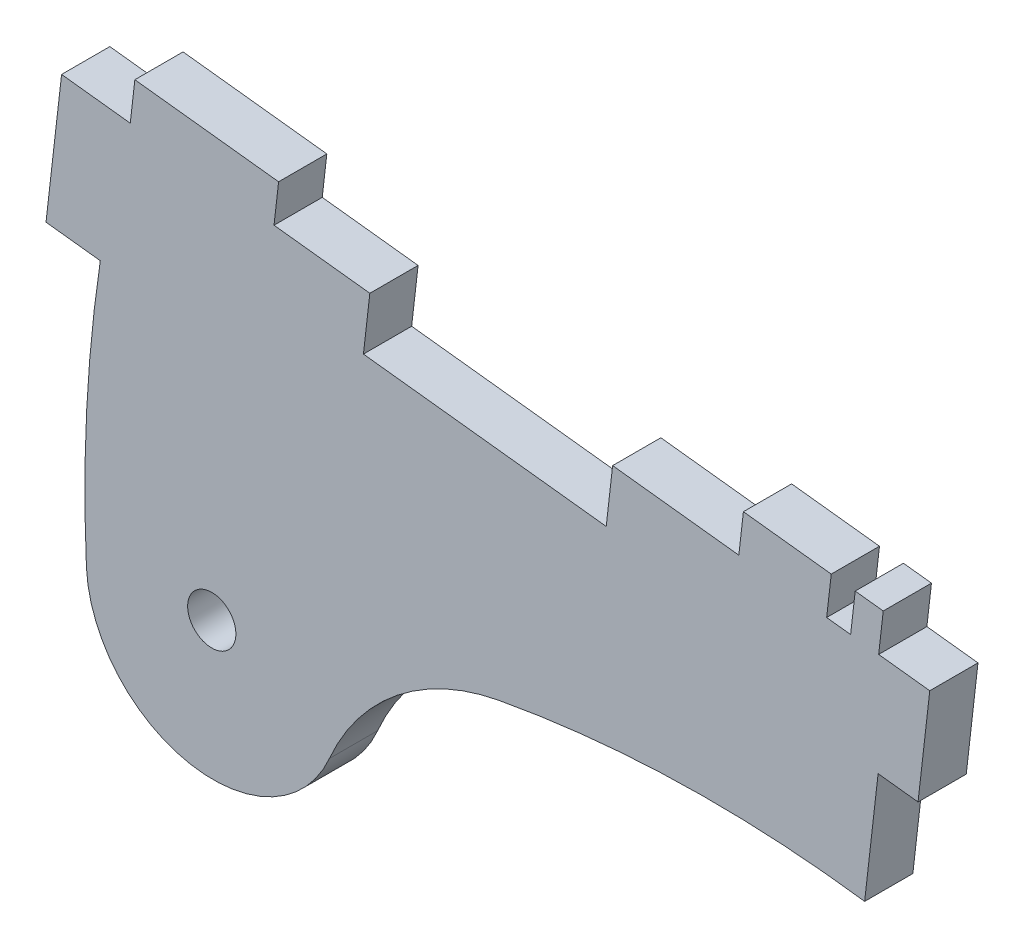
ISO-10303-21;
HEADER;
FILE_DESCRIPTION(('STEP AP214'),'2;1');
FILE_NAME('part.step','',(''),(''),'','','');
FILE_SCHEMA(('AUTOMOTIVE_DESIGN { 1 0 10303 214 1 1 1 1 }'));
ENDSEC;
DATA;
#1=APPLICATION_CONTEXT('core data for automotive mechanical design processes');
#2=APPLICATION_PROTOCOL_DEFINITION('international standard','automotive_design',2000,#1);
#3=PRODUCT_CONTEXT('',#1,'mechanical');
#4=PRODUCT('Part','Part','',(#3));
#5=PRODUCT_RELATED_PRODUCT_CATEGORY('part','',(#4));
#6=PRODUCT_DEFINITION_FORMATION('','',#4);
#7=PRODUCT_DEFINITION_CONTEXT('part definition',#1,'design');
#8=PRODUCT_DEFINITION('design','',#6,#7);
#9=PRODUCT_DEFINITION_SHAPE('','',#8);
#10=(LENGTH_UNIT() NAMED_UNIT(*) SI_UNIT(.MILLI.,.METRE.));
#11=(NAMED_UNIT(*) PLANE_ANGLE_UNIT() SI_UNIT($,.RADIAN.));
#12=(NAMED_UNIT(*) SI_UNIT($,.STERADIAN.) SOLID_ANGLE_UNIT());
#13=UNCERTAINTY_MEASURE_WITH_UNIT(LENGTH_MEASURE(1.E-05),#10,'distance_accuracy_value','');
#14=(GEOMETRIC_REPRESENTATION_CONTEXT(3) GLOBAL_UNCERTAINTY_ASSIGNED_CONTEXT((#13)) GLOBAL_UNIT_ASSIGNED_CONTEXT((#10,
#11,#12)) REPRESENTATION_CONTEXT('',''));
#15=CARTESIAN_POINT('',(0.,0.,0.));
#16=DIRECTION('',(0.,0.,1.));
#17=DIRECTION('',(1.,0.,0.));
#18=AXIS2_PLACEMENT_3D('',#15,#16,#17);
#19=CARTESIAN_POINT('',(1154.17030221944,1982.45170515298,-3.));
#20=DIRECTION('',(0.114005909847804,0.993480071526236,0.));
#21=DIRECTION('',(-0.993480071526236,0.114005909847804,0.));
#22=AXIS2_PLACEMENT_3D('',#19,#20,#21);
#23=PLANE('',#22);
#24=DIRECTION('',(-0.993480071526236,0.114005909847804,0.));
#25=VECTOR('',#24,1.);
#26=CARTESIAN_POINT('',(1154.17030221944,1982.45170515298,0.));
#27=LINE('',#26,#25);
#28=CARTESIAN_POINT('',(1158.442266527,1981.96147974063,0.));
#29=VERTEX_POINT('',#28);
#30=CARTESIAN_POINT('',(1154.17030221944,1982.45170515298,0.));
#31=VERTEX_POINT('',#30);
#32=EDGE_CURVE('E242',#29,#31,#27,.T.);
#33=ORIENTED_EDGE('',*,*,#32,.F.);
#34=DIRECTION('',(0.,0.,1.));
#35=VECTOR('',#34,1.);
#36=CARTESIAN_POINT('',(1158.442266527,1981.96147974063,-3.));
#37=LINE('',#36,#35);
#38=CARTESIAN_POINT('',(1158.442266527,1981.96147974063,-3.));
#39=VERTEX_POINT('',#38);
#40=EDGE_CURVE('E11',#39,#29,#37,.T.);
#41=ORIENTED_EDGE('',*,*,#40,.F.);
#42=DIRECTION('',(-0.993480071526236,0.114005909847804,0.));
#43=VECTOR('',#42,1.);
#44=CARTESIAN_POINT('',(1154.17030221944,1982.45170515298,-3.));
#45=LINE('',#44,#43);
#46=CARTESIAN_POINT('',(1154.17030221944,1982.45170515298,-3.));
#47=VERTEX_POINT('',#46);
#48=EDGE_CURVE('E317',#39,#47,#45,.T.);
#49=ORIENTED_EDGE('',*,*,#48,.T.);
#50=DIRECTION('',(0.,0.,1.));
#51=VECTOR('',#50,1.);
#52=CARTESIAN_POINT('',(1154.17030221944,1982.45170515298,-3.));
#53=LINE('',#52,#51);
#54=EDGE_CURVE('E40',#47,#31,#53,.T.);
#55=ORIENTED_EDGE('',*,*,#54,.T.);
#56=EDGE_LOOP('',(#33,#41,#49,#55));
#57=FACE_BOUND('',#56,.T.);
#58=ADVANCED_FACE('F37',(#57),#23,.T.);
#59=CARTESIAN_POINT('',(1158.442266527,1981.96147974063,-3.));
#60=DIRECTION('',(-0.993480071526231,0.114005909847846,0.));
#61=DIRECTION('',(-0.114005909847846,-0.993480071526231,0.));
#62=AXIS2_PLACEMENT_3D('',#59,#60,#61);
#63=PLANE('',#62);
#64=DIRECTION('',(-0.114005909847846,-0.993480071526231,0.));
#65=VECTOR('',#64,1.);
#66=CARTESIAN_POINT('',(1158.442266527,1981.96147974063,0.));
#67=LINE('',#66,#65);
#68=CARTESIAN_POINT('',(1158.72728130162,1984.44517991945,0.));
#69=VERTEX_POINT('',#68);
#70=EDGE_CURVE('E315',#69,#29,#67,.T.);
#71=ORIENTED_EDGE('',*,*,#70,.F.);
#72=DIRECTION('',(0.,0.,1.));
#73=VECTOR('',#72,1.);
#74=CARTESIAN_POINT('',(1158.72728130162,1984.44517991945,-3.));
#75=LINE('',#74,#73);
#76=CARTESIAN_POINT('',(1158.72728130162,1984.44517991945,-3.));
#77=VERTEX_POINT('',#76);
#78=EDGE_CURVE('E46',#77,#69,#75,.T.);
#79=ORIENTED_EDGE('',*,*,#78,.F.);
#80=DIRECTION('',(-0.114005909847846,-0.993480071526231,0.));
#81=VECTOR('',#80,1.);
#82=CARTESIAN_POINT('',(1158.442266527,1981.96147974063,-3.));
#83=LINE('',#82,#81);
#84=EDGE_CURVE('E232',#77,#39,#83,.T.);
#85=ORIENTED_EDGE('',*,*,#84,.T.);
#86=ORIENTED_EDGE('',*,*,#40,.T.);
#87=EDGE_LOOP('',(#71,#79,#85,#86));
#88=FACE_BOUND('',#87,.T.);
#89=ADVANCED_FACE('F365',(#88),#63,.T.);
#90=CARTESIAN_POINT('',(1158.72728130162,1984.44517991945,-3.));
#91=DIRECTION('',(0.114005909847794,0.993480071526237,0.));
#92=DIRECTION('',(-0.993480071526237,0.114005909847794,0.));
#93=AXIS2_PLACEMENT_3D('',#90,#91,#92);
#94=PLANE('',#93);
#95=DIRECTION('',(-0.993480071526237,0.114005909847794,0.));
#96=VECTOR('',#95,1.);
#97=CARTESIAN_POINT('',(1158.72728130162,1984.44517991945,0.));
#98=LINE('',#97,#96);
#99=CARTESIAN_POINT('',(1167.66860194535,1983.41912673082,0.));
#100=VERTEX_POINT('',#99);
#101=EDGE_CURVE('E219',#100,#69,#98,.T.);
#102=ORIENTED_EDGE('',*,*,#101,.F.);
#103=DIRECTION('',(0.,0.,1.));
#104=VECTOR('',#103,1.);
#105=CARTESIAN_POINT('',(1167.66860194535,1983.41912673082,-3.));
#106=LINE('',#105,#104);
#107=CARTESIAN_POINT('',(1167.66860194535,1983.41912673082,-3.));
#108=VERTEX_POINT('',#107);
#109=EDGE_CURVE('E214',#108,#100,#106,.T.);
#110=ORIENTED_EDGE('',*,*,#109,.F.);
#111=DIRECTION('',(-0.993480071526237,0.114005909847794,0.));
#112=VECTOR('',#111,1.);
#113=CARTESIAN_POINT('',(1158.72728130162,1984.44517991945,-3.));
#114=LINE('',#113,#112);
#115=EDGE_CURVE('E217',#108,#77,#114,.T.);
#116=ORIENTED_EDGE('',*,*,#115,.T.);
#117=ORIENTED_EDGE('',*,*,#78,.T.);
#118=EDGE_LOOP('',(#102,#110,#116,#117));
#119=FACE_BOUND('',#118,.T.);
#120=ADVANCED_FACE('F216',(#119),#94,.T.);
#121=CARTESIAN_POINT('',(1167.66860194535,1983.41912673082,-3.));
#122=DIRECTION('',(0.993480071526231,-0.114005909847846,0.));
#123=DIRECTION('',(0.114005909847846,0.993480071526231,0.));
#124=AXIS2_PLACEMENT_3D('',#121,#122,#123);
#125=PLANE('',#124);
#126=DIRECTION('',(0.114005909847846,0.993480071526231,0.));
#127=VECTOR('',#126,1.);
#128=CARTESIAN_POINT('',(1167.66860194535,1983.41912673082,0.));
#129=LINE('',#128,#127);
#130=CARTESIAN_POINT('',(1167.38358717073,1980.935426552,0.));
#131=VERTEX_POINT('',#130);
#132=EDGE_CURVE('E312',#131,#100,#129,.T.);
#133=ORIENTED_EDGE('',*,*,#132,.F.);
#134=DIRECTION('',(0.,0.,1.));
#135=VECTOR('',#134,1.);
#136=CARTESIAN_POINT('',(1167.38358717073,1980.935426552,-3.));
#137=LINE('',#136,#135);
#138=CARTESIAN_POINT('',(1167.38358717073,1980.935426552,-3.));
#139=VERTEX_POINT('',#138);
#140=EDGE_CURVE('E224',#139,#131,#137,.T.);
#141=ORIENTED_EDGE('',*,*,#140,.F.);
#142=DIRECTION('',(0.114005909847846,0.993480071526231,0.));
#143=VECTOR('',#142,1.);
#144=CARTESIAN_POINT('',(1167.66860194535,1983.41912673082,-3.));
#145=LINE('',#144,#143);
#146=EDGE_CURVE('E230',#139,#108,#145,.T.);
#147=ORIENTED_EDGE('',*,*,#146,.T.);
#148=ORIENTED_EDGE('',*,*,#109,.T.);
#149=EDGE_LOOP('',(#133,#141,#147,#148));
#150=FACE_BOUND('',#149,.T.);
#151=ADVANCED_FACE('F234',(#150),#125,.T.);
#152=CARTESIAN_POINT('',(1167.38358717073,1980.935426552,-3.));
#153=DIRECTION('',(0.114005909847892,0.993480071526226,0.));
#154=DIRECTION('',(-0.993480071526226,0.114005909847892,0.));
#155=AXIS2_PLACEMENT_3D('',#152,#153,#154);
#156=PLANE('',#155);
#157=DIRECTION('',(-0.993480071526225,0.114005909847892,0.));
#158=VECTOR('',#157,1.);
#159=CARTESIAN_POINT('',(1167.38358717073,1980.935426552,0.));
#160=LINE('',#159,#158);
#161=CARTESIAN_POINT('',(1173.34446759989,1980.25139109292,0.));
#162=VERTEX_POINT('',#161);
#163=EDGE_CURVE('E309',#162,#131,#160,.T.);
#164=ORIENTED_EDGE('',*,*,#163,.F.);
#165=DIRECTION('',(0.,0.,1.));
#166=VECTOR('',#165,1.);
#167=CARTESIAN_POINT('',(1173.34446759989,1980.25139109292,-3.));
#168=LINE('',#167,#166);
#169=CARTESIAN_POINT('',(1173.34446759989,1980.25139109292,-3.));
#170=VERTEX_POINT('',#169);
#171=EDGE_CURVE('E321',#170,#162,#168,.T.);
#172=ORIENTED_EDGE('',*,*,#171,.F.);
#173=DIRECTION('',(-0.993480071526225,0.114005909847892,0.));
#174=VECTOR('',#173,1.);
#175=CARTESIAN_POINT('',(1167.38358717073,1980.935426552,-3.));
#176=LINE('',#175,#174);
#177=EDGE_CURVE('E235',#170,#139,#176,.T.);
#178=ORIENTED_EDGE('',*,*,#177,.T.);
#179=ORIENTED_EDGE('',*,*,#140,.T.);
#180=EDGE_LOOP('',(#164,#172,#178,#179));
#181=FACE_BOUND('',#180,.T.);
#182=ADVANCED_FACE('F378',(#181),#156,.T.);
#183=CARTESIAN_POINT('',(1173.34446759989,1980.25139109292,-3.));
#184=DIRECTION('',(0.993480071526237,-0.114005909847793,0.));
#185=DIRECTION('',(0.114005909847793,0.993480071526237,0.));
#186=AXIS2_PLACEMENT_3D('',#183,#184,#185);
#187=PLANE('',#186);
#188=DIRECTION('',(0.114005909847793,0.993480071526237,0.));
#189=VECTOR('',#188,1.);
#190=CARTESIAN_POINT('',(1173.34446759989,1980.25139109292,0.));
#191=LINE('',#190,#189);
#192=CARTESIAN_POINT('',(1172.94544691542,1976.77421084258,0.));
#193=VERTEX_POINT('',#192);
#194=EDGE_CURVE('E306',#193,#162,#191,.T.);
#195=ORIENTED_EDGE('',*,*,#194,.F.);
#196=DIRECTION('',(0.,0.,1.));
#197=VECTOR('',#196,1.);
#198=CARTESIAN_POINT('',(1172.94544691542,1976.77421084258,-3.));
#199=LINE('',#198,#197);
#200=CARTESIAN_POINT('',(1172.94544691542,1976.77421084258,-3.));
#201=VERTEX_POINT('',#200);
#202=EDGE_CURVE('E323',#201,#193,#199,.T.);
#203=ORIENTED_EDGE('',*,*,#202,.F.);
#204=DIRECTION('',(0.114005909847793,0.993480071526237,0.));
#205=VECTOR('',#204,1.);
#206=CARTESIAN_POINT('',(1173.34446759989,1980.25139109292,-3.));
#207=LINE('',#206,#205);
#208=EDGE_CURVE('E237',#201,#170,#207,.T.);
#209=ORIENTED_EDGE('',*,*,#208,.T.);
#210=ORIENTED_EDGE('',*,*,#171,.T.);
#211=EDGE_LOOP('',(#195,#203,#209,#210));
#212=FACE_BOUND('',#211,.T.);
#213=ADVANCED_FACE('F381',(#212),#187,.T.);
#214=CARTESIAN_POINT('',(1172.94544691542,1976.77421084258,-3.));
#215=DIRECTION('',(0.114005909847806,0.993480071526235,0.));
#216=DIRECTION('',(-0.993480071526235,0.114005909847806,0.));
#217=AXIS2_PLACEMENT_3D('',#214,#215,#216);
#218=PLANE('',#217);
#219=DIRECTION('',(-0.993480071526235,0.114005909847806,0.));
#220=VECTOR('',#219,1.);
#221=CARTESIAN_POINT('',(1172.94544691542,1976.77421084258,0.));
#222=LINE('',#221,#220);
#223=CARTESIAN_POINT('',(1188.04634400262,1975.04132101289,0.));
#224=VERTEX_POINT('',#223);
#225=EDGE_CURVE('E303',#224,#193,#222,.T.);
#226=ORIENTED_EDGE('',*,*,#225,.F.);
#227=DIRECTION('',(0.,0.,1.));
#228=VECTOR('',#227,1.);
#229=CARTESIAN_POINT('',(1188.04634400262,1975.04132101289,-3.));
#230=LINE('',#229,#228);
#231=CARTESIAN_POINT('',(1188.04634400262,1975.04132101289,-3.));
#232=VERTEX_POINT('',#231);
#233=EDGE_CURVE('E325',#232,#224,#230,.T.);
#234=ORIENTED_EDGE('',*,*,#233,.F.);
#235=DIRECTION('',(-0.993480071526235,0.114005909847806,0.));
#236=VECTOR('',#235,1.);
#237=CARTESIAN_POINT('',(1172.94544691542,1976.77421084258,-3.));
#238=LINE('',#237,#236);
#239=EDGE_CURVE('E542',#232,#201,#238,.T.);
#240=ORIENTED_EDGE('',*,*,#239,.T.);
#241=ORIENTED_EDGE('',*,*,#202,.T.);
#242=EDGE_LOOP('',(#226,#234,#240,#241));
#243=FACE_BOUND('',#242,.T.);
#244=ADVANCED_FACE('F385',(#243),#218,.T.);
#245=CARTESIAN_POINT('',(1188.04634400262,1975.04132101289,-3.));
#246=DIRECTION('',(-0.993480071526244,0.11400590984773,0.));
#247=DIRECTION('',(-0.11400590984773,-0.993480071526244,0.));
#248=AXIS2_PLACEMENT_3D('',#245,#246,#247);
#249=PLANE('',#248);
#250=DIRECTION('',(-0.11400590984773,-0.993480071526244,0.));
#251=VECTOR('',#250,1.);
#252=CARTESIAN_POINT('',(1188.04634400262,1975.04132101289,0.));
#253=LINE('',#252,#251);
#254=CARTESIAN_POINT('',(1188.44536468709,1978.51850126323,0.));
#255=VERTEX_POINT('',#254);
#256=EDGE_CURVE('E300',#255,#224,#253,.T.);
#257=ORIENTED_EDGE('',*,*,#256,.F.);
#258=DIRECTION('',(0.,0.,1.));
#259=VECTOR('',#258,1.);
#260=CARTESIAN_POINT('',(1188.44536468709,1978.51850126323,-3.));
#261=LINE('',#260,#259);
#262=CARTESIAN_POINT('',(1188.44536468709,1978.51850126323,-3.));
#263=VERTEX_POINT('',#262);
#264=EDGE_CURVE('E327',#263,#255,#261,.T.);
#265=ORIENTED_EDGE('',*,*,#264,.F.);
#266=DIRECTION('',(-0.11400590984773,-0.993480071526244,0.));
#267=VECTOR('',#266,1.);
#268=CARTESIAN_POINT('',(1188.04634400262,1975.04132101289,-3.));
#269=LINE('',#268,#267);
#270=EDGE_CURVE('E539',#263,#232,#269,.T.);
#271=ORIENTED_EDGE('',*,*,#270,.T.);
#272=ORIENTED_EDGE('',*,*,#233,.T.);
#273=EDGE_LOOP('',(#257,#265,#271,#272));
#274=FACE_BOUND('',#273,.T.);
#275=ADVANCED_FACE('F389',(#274),#249,.T.);
#276=CARTESIAN_POINT('',(1188.44536468709,1978.51850126323,-3.));
#277=DIRECTION('',(0.114005909847777,0.993480071526239,0.));
#278=DIRECTION('',(-0.993480071526239,0.114005909847777,0.));
#279=AXIS2_PLACEMENT_3D('',#276,#277,#278);
#280=PLANE('',#279);
#281=DIRECTION('',(-0.993480071526239,0.114005909847777,0.));
#282=VECTOR('',#281,1.);
#283=CARTESIAN_POINT('',(1188.44536468709,1978.51850126323,0.));
#284=LINE('',#283,#282);
#285=CARTESIAN_POINT('',(1196.29385725215,1977.61785457543,0.));
#286=VERTEX_POINT('',#285);
#287=EDGE_CURVE('E297',#286,#255,#284,.T.);
#288=ORIENTED_EDGE('',*,*,#287,.F.);
#289=DIRECTION('',(0.,0.,1.));
#290=VECTOR('',#289,1.);
#291=CARTESIAN_POINT('',(1196.29385725215,1977.61785457543,-3.));
#292=LINE('',#291,#290);
#293=CARTESIAN_POINT('',(1196.29385725215,1977.61785457543,-3.));
#294=VERTEX_POINT('',#293);
#295=EDGE_CURVE('E329',#294,#286,#292,.T.);
#296=ORIENTED_EDGE('',*,*,#295,.F.);
#297=DIRECTION('',(-0.993480071526239,0.114005909847777,0.));
#298=VECTOR('',#297,1.);
#299=CARTESIAN_POINT('',(1188.44536468709,1978.51850126323,-3.));
#300=LINE('',#299,#298);
#301=EDGE_CURVE('E536',#294,#263,#300,.T.);
#302=ORIENTED_EDGE('',*,*,#301,.T.);
#303=ORIENTED_EDGE('',*,*,#264,.T.);
#304=EDGE_LOOP('',(#288,#296,#302,#303));
#305=FACE_BOUND('',#304,.T.);
#306=ADVANCED_FACE('F393',(#305),#280,.T.);
#307=CARTESIAN_POINT('',(1196.29385725215,1977.61785457543,-3.));
#308=DIRECTION('',(-0.993480071526241,0.114005909847758,0.));
#309=DIRECTION('',(-0.114005909847758,-0.993480071526241,0.));
#310=AXIS2_PLACEMENT_3D('',#307,#308,#309);
#311=PLANE('',#310);
#312=DIRECTION('',(-0.114005909847758,-0.993480071526241,0.));
#313=VECTOR('',#312,1.);
#314=CARTESIAN_POINT('',(1196.29385725215,1977.61785457543,0.));
#315=LINE('',#314,#313);
#316=CARTESIAN_POINT('',(1196.57887202677,1980.10155475425,0.));
#317=VERTEX_POINT('',#316);
#318=EDGE_CURVE('E294',#317,#286,#315,.T.);
#319=ORIENTED_EDGE('',*,*,#318,.F.);
#320=DIRECTION('',(0.,0.,1.));
#321=VECTOR('',#320,1.);
#322=CARTESIAN_POINT('',(1196.57887202677,1980.10155475425,-3.));
#323=LINE('',#322,#321);
#324=CARTESIAN_POINT('',(1196.57887202677,1980.10155475425,-3.));
#325=VERTEX_POINT('',#324);
#326=EDGE_CURVE('E331',#325,#317,#323,.T.);
#327=ORIENTED_EDGE('',*,*,#326,.F.);
#328=DIRECTION('',(-0.114005909847758,-0.993480071526241,0.));
#329=VECTOR('',#328,1.);
#330=CARTESIAN_POINT('',(1196.29385725215,1977.61785457543,-3.));
#331=LINE('',#330,#329);
#332=EDGE_CURVE('E533',#325,#294,#331,.T.);
#333=ORIENTED_EDGE('',*,*,#332,.T.);
#334=ORIENTED_EDGE('',*,*,#295,.T.);
#335=EDGE_LOOP('',(#319,#327,#333,#334));
#336=FACE_BOUND('',#335,.T.);
#337=ADVANCED_FACE('F397',(#336),#311,.T.);
#338=CARTESIAN_POINT('',(1196.57887202677,1980.10155475425,-3.));
#339=DIRECTION('',(0.114005909847789,0.993480071526237,0.));
#340=DIRECTION('',(-0.993480071526238,0.114005909847789,0.));
#341=AXIS2_PLACEMENT_3D('',#338,#339,#340);
#342=PLANE('',#341);
#343=DIRECTION('',(-0.993480071526238,0.114005909847789,0.));
#344=VECTOR('',#343,1.);
#345=CARTESIAN_POINT('',(1196.57887202677,1980.10155475425,0.));
#346=LINE('',#345,#344);
#347=CARTESIAN_POINT('',(1202.04301242016,1979.47452225009,0.));
#348=VERTEX_POINT('',#347);
#349=EDGE_CURVE('E291',#348,#317,#346,.T.);
#350=ORIENTED_EDGE('',*,*,#349,.F.);
#351=DIRECTION('',(0.,0.,1.));
#352=VECTOR('',#351,1.);
#353=CARTESIAN_POINT('',(1202.04301242016,1979.47452225009,-3.));
#354=LINE('',#353,#352);
#355=CARTESIAN_POINT('',(1202.04301242016,1979.47452225009,-3.));
#356=VERTEX_POINT('',#355);
#357=EDGE_CURVE('E333',#356,#348,#354,.T.);
#358=ORIENTED_EDGE('',*,*,#357,.F.);
#359=DIRECTION('',(-0.993480071526238,0.114005909847789,0.));
#360=VECTOR('',#359,1.);
#361=CARTESIAN_POINT('',(1196.57887202677,1980.10155475425,-3.));
#362=LINE('',#361,#360);
#363=EDGE_CURVE('E530',#356,#325,#362,.T.);
#364=ORIENTED_EDGE('',*,*,#363,.T.);
#365=ORIENTED_EDGE('',*,*,#326,.T.);
#366=EDGE_LOOP('',(#350,#358,#364,#365));
#367=FACE_BOUND('',#366,.T.);
#368=ADVANCED_FACE('F401',(#367),#342,.T.);
#369=CARTESIAN_POINT('',(1202.04301242016,1979.47452225009,-3.));
#370=DIRECTION('',(0.993480071526231,-0.114005909847846,0.));
#371=DIRECTION('',(0.114005909847846,0.993480071526231,0.));
#372=AXIS2_PLACEMENT_3D('',#369,#370,#371);
#373=PLANE('',#372);
#374=DIRECTION('',(0.114005909847846,0.993480071526231,0.));
#375=VECTOR('',#374,1.);
#376=CARTESIAN_POINT('',(1202.04301242016,1979.47452225009,0.));
#377=LINE('',#376,#375);
#378=CARTESIAN_POINT('',(1201.75799764554,1976.99082207127,0.));
#379=VERTEX_POINT('',#378);
#380=EDGE_CURVE('E288',#379,#348,#377,.T.);
#381=ORIENTED_EDGE('',*,*,#380,.F.);
#382=DIRECTION('',(0.,0.,1.));
#383=VECTOR('',#382,1.);
#384=CARTESIAN_POINT('',(1201.75799764554,1976.99082207127,-3.));
#385=LINE('',#384,#383);
#386=CARTESIAN_POINT('',(1201.75799764554,1976.99082207127,-3.));
#387=VERTEX_POINT('',#386);
#388=EDGE_CURVE('E335',#387,#379,#385,.T.);
#389=ORIENTED_EDGE('',*,*,#388,.F.);
#390=DIRECTION('',(0.114005909847846,0.993480071526231,0.));
#391=VECTOR('',#390,1.);
#392=CARTESIAN_POINT('',(1202.04301242016,1979.47452225009,-3.));
#393=LINE('',#392,#391);
#394=EDGE_CURVE('E527',#387,#356,#393,.T.);
#395=ORIENTED_EDGE('',*,*,#394,.T.);
#396=ORIENTED_EDGE('',*,*,#357,.T.);
#397=EDGE_LOOP('',(#381,#389,#395,#396));
#398=FACE_BOUND('',#397,.T.);
#399=ADVANCED_FACE('F405',(#398),#373,.T.);
#400=CARTESIAN_POINT('',(1201.75799764554,1976.99082207127,-3.));
#401=DIRECTION('',(0.114005909847807,0.993480071526235,0.));
#402=DIRECTION('',(-0.993480071526236,0.114005909847807,0.));
#403=AXIS2_PLACEMENT_3D('',#400,#401,#402);
#404=PLANE('',#403);
#405=DIRECTION('',(-0.993480071526235,0.114005909847807,0.));
#406=VECTOR('',#405,1.);
#407=CARTESIAN_POINT('',(1201.75799764554,1976.99082207127,0.));
#408=LINE('',#407,#406);
#409=CARTESIAN_POINT('',(1203.24821775283,1976.8198132065,0.));
#410=VERTEX_POINT('',#409);
#411=EDGE_CURVE('E285',#410,#379,#408,.T.);
#412=ORIENTED_EDGE('',*,*,#411,.F.);
#413=DIRECTION('',(0.,0.,1.));
#414=VECTOR('',#413,1.);
#415=CARTESIAN_POINT('',(1203.24821775283,1976.8198132065,-3.));
#416=LINE('',#415,#414);
#417=CARTESIAN_POINT('',(1203.24821775283,1976.8198132065,-3.));
#418=VERTEX_POINT('',#417);
#419=EDGE_CURVE('E337',#418,#410,#416,.T.);
#420=ORIENTED_EDGE('',*,*,#419,.F.);
#421=DIRECTION('',(-0.993480071526235,0.114005909847807,0.));
#422=VECTOR('',#421,1.);
#423=CARTESIAN_POINT('',(1201.75799764554,1976.99082207127,-3.));
#424=LINE('',#423,#422);
#425=EDGE_CURVE('E524',#418,#387,#424,.T.);
#426=ORIENTED_EDGE('',*,*,#425,.T.);
#427=ORIENTED_EDGE('',*,*,#388,.T.);
#428=EDGE_LOOP('',(#412,#420,#426,#427));
#429=FACE_BOUND('',#428,.T.);
#430=ADVANCED_FACE('F409',(#429),#404,.T.);
#431=CARTESIAN_POINT('',(1203.24821775283,1976.8198132065,-3.));
#432=DIRECTION('',(-0.993480071526241,0.114005909847758,0.));
#433=DIRECTION('',(-0.114005909847758,-0.993480071526241,0.));
#434=AXIS2_PLACEMENT_3D('',#431,#432,#433);
#435=PLANE('',#434);
#436=DIRECTION('',(-0.114005909847758,-0.993480071526241,0.));
#437=VECTOR('',#436,1.);
#438=CARTESIAN_POINT('',(1203.24821775283,1976.8198132065,0.));
#439=LINE('',#438,#437);
#440=CARTESIAN_POINT('',(1203.53323252745,1979.30351338531,0.));
#441=VERTEX_POINT('',#440);
#442=EDGE_CURVE('E282',#441,#410,#439,.T.);
#443=ORIENTED_EDGE('',*,*,#442,.F.);
#444=DIRECTION('',(0.,0.,1.));
#445=VECTOR('',#444,1.);
#446=CARTESIAN_POINT('',(1203.53323252745,1979.30351338531,-3.));
#447=LINE('',#446,#445);
#448=CARTESIAN_POINT('',(1203.53323252745,1979.30351338531,-3.));
#449=VERTEX_POINT('',#448);
#450=EDGE_CURVE('E339',#449,#441,#447,.T.);
#451=ORIENTED_EDGE('',*,*,#450,.F.);
#452=DIRECTION('',(-0.114005909847758,-0.993480071526241,0.));
#453=VECTOR('',#452,1.);
#454=CARTESIAN_POINT('',(1203.24821775283,1976.8198132065,-3.));
#455=LINE('',#454,#453);
#456=EDGE_CURVE('E521',#449,#418,#455,.T.);
#457=ORIENTED_EDGE('',*,*,#456,.T.);
#458=ORIENTED_EDGE('',*,*,#419,.T.);
#459=EDGE_LOOP('',(#443,#451,#457,#458));
#460=FACE_BOUND('',#459,.T.);
#461=ADVANCED_FACE('F413',(#460),#435,.T.);
#462=CARTESIAN_POINT('',(1203.53323252745,1979.30351338531,-3.));
#463=DIRECTION('',(0.114005909847745,0.993480071526243,0.));
#464=DIRECTION('',(-0.993480071526243,0.114005909847745,0.));
#465=AXIS2_PLACEMENT_3D('',#462,#463,#464);
#466=PLANE('',#465);
#467=DIRECTION('',(-0.993480071526243,0.114005909847745,0.));
#468=VECTOR('',#467,1.);
#469=CARTESIAN_POINT('',(1203.53323252745,1979.30351338531,0.));
#470=LINE('',#469,#468);
#471=CARTESIAN_POINT('',(1205.2769084229,1979.1034194301,0.));
#472=VERTEX_POINT('',#471);
#473=EDGE_CURVE('E279',#472,#441,#470,.T.);
#474=ORIENTED_EDGE('',*,*,#473,.F.);
#475=DIRECTION('',(0.,0.,1.));
#476=VECTOR('',#475,1.);
#477=CARTESIAN_POINT('',(1205.2769084229,1979.1034194301,-3.));
#478=LINE('',#477,#476);
#479=CARTESIAN_POINT('',(1205.2769084229,1979.1034194301,-3.));
#480=VERTEX_POINT('',#479);
#481=EDGE_CURVE('E341',#480,#472,#478,.T.);
#482=ORIENTED_EDGE('',*,*,#481,.F.);
#483=DIRECTION('',(-0.993480071526243,0.114005909847745,0.));
#484=VECTOR('',#483,1.);
#485=CARTESIAN_POINT('',(1203.53323252745,1979.30351338531,-3.));
#486=LINE('',#485,#484);
#487=EDGE_CURVE('E518',#480,#449,#486,.T.);
#488=ORIENTED_EDGE('',*,*,#487,.T.);
#489=ORIENTED_EDGE('',*,*,#450,.T.);
#490=EDGE_LOOP('',(#474,#482,#488,#489));
#491=FACE_BOUND('',#490,.T.);
#492=ADVANCED_FACE('F417',(#491),#466,.T.);
#493=CARTESIAN_POINT('',(1205.2769084229,1979.1034194301,-3.));
#494=DIRECTION('',(0.993480071526241,-0.114005909847758,0.));
#495=DIRECTION('',(0.114005909847758,0.993480071526241,0.));
#496=AXIS2_PLACEMENT_3D('',#493,#494,#495);
#497=PLANE('',#496);
#498=DIRECTION('',(0.114005909847758,0.993480071526241,0.));
#499=VECTOR('',#498,1.);
#500=CARTESIAN_POINT('',(1205.2769084229,1979.1034194301,0.));
#501=LINE('',#500,#499);
#502=CARTESIAN_POINT('',(1204.99189364828,1976.61971925128,0.));
#503=VERTEX_POINT('',#502);
#504=EDGE_CURVE('E276',#503,#472,#501,.T.);
#505=ORIENTED_EDGE('',*,*,#504,.F.);
#506=DIRECTION('',(0.,0.,1.));
#507=VECTOR('',#506,1.);
#508=CARTESIAN_POINT('',(1204.99189364828,1976.61971925128,-3.));
#509=LINE('',#508,#507);
#510=CARTESIAN_POINT('',(1204.99189364828,1976.61971925128,-3.));
#511=VERTEX_POINT('',#510);
#512=EDGE_CURVE('E343',#511,#503,#509,.T.);
#513=ORIENTED_EDGE('',*,*,#512,.F.);
#514=DIRECTION('',(0.114005909847758,0.993480071526241,0.));
#515=VECTOR('',#514,1.);
#516=CARTESIAN_POINT('',(1205.2769084229,1979.1034194301,-3.));
#517=LINE('',#516,#515);
#518=EDGE_CURVE('E515',#511,#480,#517,.T.);
#519=ORIENTED_EDGE('',*,*,#518,.T.);
#520=ORIENTED_EDGE('',*,*,#481,.T.);
#521=EDGE_LOOP('',(#505,#513,#519,#520));
#522=FACE_BOUND('',#521,.T.);
#523=ADVANCED_FACE('F421',(#522),#497,.T.);
#524=CARTESIAN_POINT('',(1204.99189364828,1976.61971925128,-3.));
#525=DIRECTION('',(0.114005909847834,0.993480071526232,0.));
#526=DIRECTION('',(-0.993480071526232,0.114005909847835,0.));
#527=AXIS2_PLACEMENT_3D('',#524,#525,#526);
#528=PLANE('',#527);
#529=DIRECTION('',(-0.993480071526232,0.114005909847834,0.));
#530=VECTOR('',#529,1.);
#531=CARTESIAN_POINT('',(1204.99189364828,1976.61971925128,0.));
#532=LINE('',#531,#530);
#533=CARTESIAN_POINT('',(1208.17102987716,1976.25490033977,0.));
#534=VERTEX_POINT('',#533);
#535=EDGE_CURVE('E273',#534,#503,#532,.T.);
#536=ORIENTED_EDGE('',*,*,#535,.F.);
#537=DIRECTION('',(0.,0.,1.));
#538=VECTOR('',#537,1.);
#539=CARTESIAN_POINT('',(1208.17102987716,1976.25490033977,-3.));
#540=LINE('',#539,#538);
#541=CARTESIAN_POINT('',(1208.17102987716,1976.25490033977,-3.));
#542=VERTEX_POINT('',#541);
#543=EDGE_CURVE('E345',#542,#534,#540,.T.);
#544=ORIENTED_EDGE('',*,*,#543,.F.);
#545=DIRECTION('',(-0.993480071526232,0.114005909847834,0.));
#546=VECTOR('',#545,1.);
#547=CARTESIAN_POINT('',(1204.99189364828,1976.61971925128,-3.));
#548=LINE('',#547,#546);
#549=EDGE_CURVE('E512',#542,#511,#548,.T.);
#550=ORIENTED_EDGE('',*,*,#549,.T.);
#551=ORIENTED_EDGE('',*,*,#512,.T.);
#552=EDGE_LOOP('',(#536,#544,#550,#551));
#553=FACE_BOUND('',#552,.T.);
#554=ADVANCED_FACE('F425',(#553),#528,.T.);
#555=CARTESIAN_POINT('',(1208.17102987716,1976.25490033977,-3.));
#556=DIRECTION('',(0.99348007152624,-0.114005909847766,0.));
#557=DIRECTION('',(0.114005909847766,0.99348007152624,0.));
#558=AXIS2_PLACEMENT_3D('',#555,#556,#557);
#559=PLANE('',#558);
#560=DIRECTION('',(0.114005909847766,0.99348007152624,0.));
#561=VECTOR('',#560,1.);
#562=CARTESIAN_POINT('',(1208.17102987716,1976.25490033977,0.));
#563=LINE('',#562,#561);
#564=CARTESIAN_POINT('',(1207.44139205414,1969.896627882,0.));
#565=VERTEX_POINT('',#564);
#566=EDGE_CURVE('E270',#565,#534,#563,.T.);
#567=ORIENTED_EDGE('',*,*,#566,.F.);
#568=DIRECTION('',(0.,0.,1.));
#569=VECTOR('',#568,1.);
#570=CARTESIAN_POINT('',(1207.44139205414,1969.896627882,-3.));
#571=LINE('',#570,#569);
#572=CARTESIAN_POINT('',(1207.44139205414,1969.896627882,-3.));
#573=VERTEX_POINT('',#572);
#574=EDGE_CURVE('E347',#573,#565,#571,.T.);
#575=ORIENTED_EDGE('',*,*,#574,.F.);
#576=DIRECTION('',(0.114005909847766,0.99348007152624,0.));
#577=VECTOR('',#576,1.);
#578=CARTESIAN_POINT('',(1208.17102987716,1976.25490033977,-3.));
#579=LINE('',#578,#577);
#580=EDGE_CURVE('E509',#573,#542,#579,.T.);
#581=ORIENTED_EDGE('',*,*,#580,.T.);
#582=ORIENTED_EDGE('',*,*,#543,.T.);
#583=EDGE_LOOP('',(#567,#575,#581,#582));
#584=FACE_BOUND('',#583,.T.);
#585=ADVANCED_FACE('F429',(#584),#559,.T.);
#586=CARTESIAN_POINT('',(1207.44139205414,1969.896627882,-3.));
#587=DIRECTION('',(-0.114005909847846,-0.993480071526231,0.));
#588=DIRECTION('',(0.993480071526231,-0.114005909847846,0.));
#589=AXIS2_PLACEMENT_3D('',#586,#587,#588);
#590=PLANE('',#589);
#591=DIRECTION('',(0.993480071526231,-0.114005909847846,0.));
#592=VECTOR('',#591,1.);
#593=CARTESIAN_POINT('',(1207.44139205414,1969.896627882,0.));
#594=LINE('',#593,#592);
#595=CARTESIAN_POINT('',(1204.95769187532,1970.18164265662,0.));
#596=VERTEX_POINT('',#595);
#597=EDGE_CURVE('E267',#596,#565,#594,.T.);
#598=ORIENTED_EDGE('',*,*,#597,.F.);
#599=DIRECTION('',(0.,0.,1.));
#600=VECTOR('',#599,1.);
#601=CARTESIAN_POINT('',(1204.95769187532,1970.18164265662,-3.));
#602=LINE('',#601,#600);
#603=CARTESIAN_POINT('',(1204.95769187532,1970.18164265662,-3.));
#604=VERTEX_POINT('',#603);
#605=EDGE_CURVE('E349',#604,#596,#602,.T.);
#606=ORIENTED_EDGE('',*,*,#605,.F.);
#607=DIRECTION('',(0.993480071526231,-0.114005909847846,0.));
#608=VECTOR('',#607,1.);
#609=CARTESIAN_POINT('',(1207.44139205414,1969.896627882,-3.));
#610=LINE('',#609,#608);
#611=EDGE_CURVE('E506',#604,#573,#610,.T.);
#612=ORIENTED_EDGE('',*,*,#611,.T.);
#613=ORIENTED_EDGE('',*,*,#574,.T.);
#614=EDGE_LOOP('',(#598,#606,#612,#613));
#615=FACE_BOUND('',#614,.T.);
#616=ADVANCED_FACE('F433',(#615),#590,.T.);
#617=CARTESIAN_POINT('',(1204.95769187532,1970.18164265662,-3.));
#618=DIRECTION('',(0.99348007152624,-0.114005909847767,0.));
#619=DIRECTION('',(0.114005909847767,0.99348007152624,0.));
#620=AXIS2_PLACEMENT_3D('',#617,#618,#619);
#621=PLANE('',#620);
#622=DIRECTION('',(0.114005909847767,0.99348007152624,0.));
#623=VECTOR('',#622,1.);
#624=CARTESIAN_POINT('',(1204.95769187532,1970.18164265662,0.));
#625=LINE('',#624,#623);
#626=CARTESIAN_POINT('',(1204.11974843794,1962.8795641309,0.));
#627=VERTEX_POINT('',#626);
#628=EDGE_CURVE('E264',#627,#596,#625,.T.);
#629=ORIENTED_EDGE('',*,*,#628,.F.);
#630=DIRECTION('',(0.,0.,1.));
#631=VECTOR('',#630,1.);
#632=CARTESIAN_POINT('',(1204.11974843794,1962.8795641309,-3.));
#633=LINE('',#632,#631);
#634=CARTESIAN_POINT('',(1204.11974843794,1962.8795641309,-3.));
#635=VERTEX_POINT('',#634);
#636=EDGE_CURVE('E351',#635,#627,#633,.T.);
#637=ORIENTED_EDGE('',*,*,#636,.F.);
#638=DIRECTION('',(0.114005909847767,0.99348007152624,0.));
#639=VECTOR('',#638,1.);
#640=CARTESIAN_POINT('',(1204.95769187532,1970.18164265662,-3.));
#641=LINE('',#640,#639);
#642=EDGE_CURVE('E503',#635,#604,#641,.T.);
#643=ORIENTED_EDGE('',*,*,#642,.T.);
#644=ORIENTED_EDGE('',*,*,#605,.T.);
#645=EDGE_LOOP('',(#629,#637,#643,#644));
#646=FACE_BOUND('',#645,.T.);
#647=ADVANCED_FACE('F437',(#646),#621,.T.);
#648=CARTESIAN_POINT('',(1194.44354850456,1891.5807955721,-3.));
#649=DIRECTION('',(0.,0.,1.));
#650=DIRECTION('',(1.,0.,0.));
#651=AXIS2_PLACEMENT_3D('',#648,#649,#650);
#652=CYLINDRICAL_SURFACE('',#651,71.9523678773107);
#653=CARTESIAN_POINT('',(1194.44354850456,1891.5807955721,0.));
#654=DIRECTION('',(0.,0.,-1.));
#655=DIRECTION('',(-1.,0.,0.));
#656=AXIS2_PLACEMENT_3D('',#653,#654,#655);
#657=CIRCLE('',#656,71.9523678773107);
#658=CARTESIAN_POINT('',(1181.37943975855,1962.3372250031,0.));
#659=VERTEX_POINT('',#658);
#660=EDGE_CURVE('E261',#659,#627,#657,.T.);
#661=ORIENTED_EDGE('',*,*,#660,.F.);
#662=DIRECTION('',(0.,0.,1.));
#663=VECTOR('',#662,1.);
#664=CARTESIAN_POINT('',(1181.37943975855,1962.3372250031,-3.));
#665=LINE('',#664,#663);
#666=CARTESIAN_POINT('',(1181.37943975855,1962.3372250031,-3.));
#667=VERTEX_POINT('',#666);
#668=EDGE_CURVE('E353',#667,#659,#665,.T.);
#669=ORIENTED_EDGE('',*,*,#668,.F.);
#670=CARTESIAN_POINT('',(1194.44354850456,1891.5807955721,-3.));
#671=DIRECTION('',(0.,0.,-1.));
#672=DIRECTION('',(-1.,0.,0.));
#673=AXIS2_PLACEMENT_3D('',#670,#671,#672);
#674=CIRCLE('',#673,71.9523678773107);
#675=EDGE_CURVE('E500',#667,#635,#674,.T.);
#676=ORIENTED_EDGE('',*,*,#675,.T.);
#677=ORIENTED_EDGE('',*,*,#636,.T.);
#678=EDGE_LOOP('',(#661,#669,#676,#677));
#679=FACE_BOUND('',#678,.T.);
#680=ADVANCED_FACE('F441',(#679),#652,.F.);
#681=CARTESIAN_POINT('',(1183.98137608164,1948.2448955983,-3.));
#682=DIRECTION('',(0.,0.,1.));
#683=DIRECTION('',(1.,0.,0.));
#684=AXIS2_PLACEMENT_3D('',#681,#682,#683);
#685=CYLINDRICAL_SURFACE('',#684,14.3305206005496);
#686=CARTESIAN_POINT('',(1183.98137608164,1948.2448955983,0.));
#687=DIRECTION('',(0.,0.,-1.));
#688=DIRECTION('',(-1.,0.,0.));
#689=AXIS2_PLACEMENT_3D('',#686,#687,#688);
#690=CIRCLE('',#689,14.3305206005496);
#691=CARTESIAN_POINT('',(1170.82739301419,1953.93141915352,0.));
#692=VERTEX_POINT('',#691);
#693=EDGE_CURVE('E258',#692,#659,#690,.T.);
#694=ORIENTED_EDGE('',*,*,#693,.F.);
#695=DIRECTION('',(0.,0.,1.));
#696=VECTOR('',#695,1.);
#697=CARTESIAN_POINT('',(1170.82739301419,1953.93141915352,-3.));
#698=LINE('',#697,#696);
#699=CARTESIAN_POINT('',(1170.82739301419,1953.93141915352,-3.));
#700=VERTEX_POINT('',#699);
#701=EDGE_CURVE('E355',#700,#692,#698,.T.);
#702=ORIENTED_EDGE('',*,*,#701,.F.);
#703=CARTESIAN_POINT('',(1183.98137608164,1948.2448955983,-3.));
#704=DIRECTION('',(0.,0.,-1.));
#705=DIRECTION('',(-1.,0.,0.));
#706=AXIS2_PLACEMENT_3D('',#703,#704,#705);
#707=CIRCLE('',#706,14.3305206005496);
#708=EDGE_CURVE('E497',#700,#667,#707,.T.);
#709=ORIENTED_EDGE('',*,*,#708,.T.);
#710=ORIENTED_EDGE('',*,*,#668,.T.);
#711=EDGE_LOOP('',(#694,#702,#709,#710));
#712=FACE_BOUND('',#711,.T.);
#713=ADVANCED_FACE('F445',(#712),#685,.F.);
#714=CARTESIAN_POINT('',(1163.59075941327,1957.0598470389,-3.));
#715=DIRECTION('',(0.,0.,1.));
#716=DIRECTION('',(1.,0.,0.));
#717=AXIS2_PLACEMENT_3D('',#714,#715,#716);
#718=CYLINDRICAL_SURFACE('',#717,7.883903025021);
#719=CARTESIAN_POINT('',(1163.59075941327,1957.0598470389,0.));
#720=DIRECTION('',(0.,0.,1.));
#721=DIRECTION('',(1.,0.,0.));
#722=AXIS2_PLACEMENT_3D('',#719,#720,#721);
#723=CIRCLE('',#722,7.883903025021);
#724=CARTESIAN_POINT('',(1155.71562217143,1956.68817469662,0.));
#725=VERTEX_POINT('',#724);
#726=EDGE_CURVE('E255',#725,#692,#723,.T.);
#727=ORIENTED_EDGE('',*,*,#726,.F.);
#728=DIRECTION('',(0.,0.,1.));
#729=VECTOR('',#728,1.);
#730=CARTESIAN_POINT('',(1155.71562217143,1956.68817469662,-3.));
#731=LINE('',#730,#729);
#732=CARTESIAN_POINT('',(1155.71562217143,1956.68817469662,-3.));
#733=VERTEX_POINT('',#732);
#734=EDGE_CURVE('E357',#733,#725,#731,.T.);
#735=ORIENTED_EDGE('',*,*,#734,.F.);
#736=CARTESIAN_POINT('',(1163.59075941327,1957.0598470389,-3.));
#737=DIRECTION('',(0.,0.,1.));
#738=DIRECTION('',(1.,0.,0.));
#739=AXIS2_PLACEMENT_3D('',#736,#737,#738);
#740=CIRCLE('',#739,7.883903025021);
#741=EDGE_CURVE('E494',#733,#700,#740,.T.);
#742=ORIENTED_EDGE('',*,*,#741,.T.);
#743=ORIENTED_EDGE('',*,*,#701,.T.);
#744=EDGE_LOOP('',(#727,#735,#742,#743));
#745=FACE_BOUND('',#744,.T.);
#746=ADVANCED_FACE('F449',(#745),#718,.T.);
#747=CARTESIAN_POINT('',(1242.15390614376,1960.76768702508,-3.));
#748=DIRECTION('',(0.,0.,1.));
#749=DIRECTION('',(1.,0.,0.));
#750=AXIS2_PLACEMENT_3D('',#747,#748,#749);
#751=CYLINDRICAL_SURFACE('',#750,86.534498074005);
#752=CARTESIAN_POINT('',(1242.15390614376,1960.76768702508,0.));
#753=DIRECTION('',(0.,0.,1.));
#754=DIRECTION('',(1.,0.,0.));
#755=AXIS2_PLACEMENT_3D('',#752,#753,#754);
#756=CIRCLE('',#755,86.534498074005);
#757=CARTESIAN_POINT('',(1156.57908422892,1973.61950445152,0.));
#758=VERTEX_POINT('',#757);
#759=EDGE_CURVE('E252',#758,#725,#756,.T.);
#760=ORIENTED_EDGE('',*,*,#759,.F.);
#761=DIRECTION('',(0.,0.,1.));
#762=VECTOR('',#761,1.);
#763=CARTESIAN_POINT('',(1156.57908422892,1973.61950445152,-3.));
#764=LINE('',#763,#762);
#765=CARTESIAN_POINT('',(1156.57908422892,1973.61950445152,-3.));
#766=VERTEX_POINT('',#765);
#767=EDGE_CURVE('E359',#766,#758,#764,.T.);
#768=ORIENTED_EDGE('',*,*,#767,.F.);
#769=CARTESIAN_POINT('',(1242.15390614376,1960.76768702508,-3.));
#770=DIRECTION('',(0.,0.,1.));
#771=DIRECTION('',(1.,0.,0.));
#772=AXIS2_PLACEMENT_3D('',#769,#770,#771);
#773=CIRCLE('',#772,86.534498074005);
#774=EDGE_CURVE('E491',#766,#733,#773,.T.);
#775=ORIENTED_EDGE('',*,*,#774,.T.);
#776=ORIENTED_EDGE('',*,*,#734,.T.);
#777=EDGE_LOOP('',(#760,#768,#775,#776));
#778=FACE_BOUND('',#777,.T.);
#779=ADVANCED_FACE('F453',(#778),#751,.T.);
#780=CARTESIAN_POINT('',(1153.20125198573,1974.00712454501,-3.));
#781=DIRECTION('',(-0.114005909847852,-0.99348007152623,0.));
#782=DIRECTION('',(0.99348007152623,-0.114005909847852,0.));
#783=AXIS2_PLACEMENT_3D('',#780,#781,#782);
#784=PLANE('',#783);
#785=DIRECTION('',(0.99348007152623,-0.114005909847852,0.));
#786=VECTOR('',#785,1.);
#787=CARTESIAN_POINT('',(1153.20125198573,1974.00712454501,0.));
#788=LINE('',#787,#786);
#789=CARTESIAN_POINT('',(1153.20125198573,1974.00712454501,0.));
#790=VERTEX_POINT('',#789);
#791=EDGE_CURVE('E249',#790,#758,#788,.T.);
#792=ORIENTED_EDGE('',*,*,#791,.F.);
#793=DIRECTION('',(0.,0.,1.));
#794=VECTOR('',#793,1.);
#795=CARTESIAN_POINT('',(1153.20125198573,1974.00712454501,-3.));
#796=LINE('',#795,#794);
#797=CARTESIAN_POINT('',(1153.20125198573,1974.00712454501,-3.));
#798=VERTEX_POINT('',#797);
#799=EDGE_CURVE('E360',#798,#790,#796,.T.);
#800=ORIENTED_EDGE('',*,*,#799,.F.);
#801=DIRECTION('',(0.99348007152623,-0.114005909847852,0.));
#802=VECTOR('',#801,1.);
#803=CARTESIAN_POINT('',(1153.20125198573,1974.00712454501,-3.));
#804=LINE('',#803,#802);
#805=EDGE_CURVE('E488',#798,#766,#804,.T.);
#806=ORIENTED_EDGE('',*,*,#805,.T.);
#807=ORIENTED_EDGE('',*,*,#767,.T.);
#808=EDGE_LOOP('',(#792,#800,#806,#807));
#809=FACE_BOUND('',#808,.T.);
#810=ADVANCED_FACE('F457',(#809),#784,.T.);
#811=CARTESIAN_POINT('',(1154.17030221944,1982.45170515298,-3.));
#812=DIRECTION('',(-0.993480071526227,0.114005909847879,0.));
#813=DIRECTION('',(-0.114005909847879,-0.993480071526227,0.));
#814=AXIS2_PLACEMENT_3D('',#811,#812,#813);
#815=PLANE('',#814);
#816=DIRECTION('',(-0.114005909847879,-0.993480071526227,0.));
#817=VECTOR('',#816,1.);
#818=CARTESIAN_POINT('',(1154.17030221944,1982.45170515298,0.));
#819=LINE('',#818,#817);
#820=EDGE_CURVE('E245',#31,#790,#819,.T.);
#821=ORIENTED_EDGE('',*,*,#820,.F.);
#822=ORIENTED_EDGE('',*,*,#54,.F.);
#823=DIRECTION('',(-0.114005909847879,-0.993480071526227,0.));
#824=VECTOR('',#823,1.);
#825=CARTESIAN_POINT('',(1154.17030221944,1982.45170515298,-3.));
#826=LINE('',#825,#824);
#827=EDGE_CURVE('E486',#47,#798,#826,.T.);
#828=ORIENTED_EDGE('',*,*,#827,.T.);
#829=ORIENTED_EDGE('',*,*,#799,.T.);
#830=EDGE_LOOP('',(#821,#822,#828,#829));
#831=FACE_BOUND('',#830,.T.);
#832=ADVANCED_FACE('F362',(#831),#815,.T.);
#833=CARTESIAN_POINT('',(1194.44354850456,1891.5807955721,-3.));
#834=DIRECTION('',(0.,0.,-1.));
#835=DIRECTION('',(-1.,0.,0.));
#836=AXIS2_PLACEMENT_3D('',#833,#834,#835);
#837=PLANE('',#836);
#838=CARTESIAN_POINT('',(1163.51227220348,1957.72545196296,-3.));
#839=DIRECTION('',(0.,0.,1.));
#840=DIRECTION('',(1.,0.,0.));
#841=AXIS2_PLACEMENT_3D('',#838,#839,#840);
#842=CIRCLE('',#841,1.49999999999996);
#843=CARTESIAN_POINT('',(1165.01227220348,1957.72545196296,-3.));
#844=VERTEX_POINT('',#843);
#845=EDGE_CURVE('E246',#844,#844,#842,.T.);
#846=ORIENTED_EDGE('',*,*,#845,.T.);
#847=EDGE_LOOP('',(#846));
#848=FACE_BOUND('',#847,.T.);
#849=ORIENTED_EDGE('',*,*,#48,.F.);
#850=ORIENTED_EDGE('',*,*,#84,.F.);
#851=ORIENTED_EDGE('',*,*,#115,.F.);
#852=ORIENTED_EDGE('',*,*,#146,.F.);
#853=ORIENTED_EDGE('',*,*,#177,.F.);
#854=ORIENTED_EDGE('',*,*,#208,.F.);
#855=ORIENTED_EDGE('',*,*,#239,.F.);
#856=ORIENTED_EDGE('',*,*,#270,.F.);
#857=ORIENTED_EDGE('',*,*,#301,.F.);
#858=ORIENTED_EDGE('',*,*,#332,.F.);
#859=ORIENTED_EDGE('',*,*,#363,.F.);
#860=ORIENTED_EDGE('',*,*,#394,.F.);
#861=ORIENTED_EDGE('',*,*,#425,.F.);
#862=ORIENTED_EDGE('',*,*,#456,.F.);
#863=ORIENTED_EDGE('',*,*,#487,.F.);
#864=ORIENTED_EDGE('',*,*,#518,.F.);
#865=ORIENTED_EDGE('',*,*,#549,.F.);
#866=ORIENTED_EDGE('',*,*,#580,.F.);
#867=ORIENTED_EDGE('',*,*,#611,.F.);
#868=ORIENTED_EDGE('',*,*,#642,.F.);
#869=ORIENTED_EDGE('',*,*,#675,.F.);
#870=ORIENTED_EDGE('',*,*,#708,.F.);
#871=ORIENTED_EDGE('',*,*,#741,.F.);
#872=ORIENTED_EDGE('',*,*,#774,.F.);
#873=ORIENTED_EDGE('',*,*,#805,.F.);
#874=ORIENTED_EDGE('',*,*,#827,.F.);
#875=EDGE_LOOP('',(#849,#850,#851,#852,#853,#854,#855,#856,#857,#858,#859,#860,#861,#862,#863,
#864,#865,#866,#867,#868,#869,#870,#871,#872,#873,#874));
#876=FACE_BOUND('',#875,.T.);
#877=ADVANCED_FACE('F228',(#848,#876),#837,.T.);
#878=CARTESIAN_POINT('',(1194.44354850456,1891.5807955721,0.));
#879=DIRECTION('',(0.,0.,-1.));
#880=DIRECTION('',(-1.,0.,0.));
#881=AXIS2_PLACEMENT_3D('',#878,#879,#880);
#882=PLANE('',#881);
#883=CARTESIAN_POINT('',(1163.51227220348,1957.72545196296,0.));
#884=DIRECTION('',(0.,0.,1.));
#885=DIRECTION('',(1.,0.,0.));
#886=AXIS2_PLACEMENT_3D('',#883,#884,#885);
#887=CIRCLE('',#886,1.49999999999996);
#888=CARTESIAN_POINT('',(1165.01227220348,1957.72545196296,0.));
#889=VERTEX_POINT('',#888);
#890=EDGE_CURVE('E481',#889,#889,#887,.T.);
#891=ORIENTED_EDGE('',*,*,#890,.F.);
#892=EDGE_LOOP('',(#891));
#893=FACE_BOUND('',#892,.T.);
#894=ORIENTED_EDGE('',*,*,#32,.T.);
#895=ORIENTED_EDGE('',*,*,#820,.T.);
#896=ORIENTED_EDGE('',*,*,#791,.T.);
#897=ORIENTED_EDGE('',*,*,#759,.T.);
#898=ORIENTED_EDGE('',*,*,#726,.T.);
#899=ORIENTED_EDGE('',*,*,#693,.T.);
#900=ORIENTED_EDGE('',*,*,#660,.T.);
#901=ORIENTED_EDGE('',*,*,#628,.T.);
#902=ORIENTED_EDGE('',*,*,#597,.T.);
#903=ORIENTED_EDGE('',*,*,#566,.T.);
#904=ORIENTED_EDGE('',*,*,#535,.T.);
#905=ORIENTED_EDGE('',*,*,#504,.T.);
#906=ORIENTED_EDGE('',*,*,#473,.T.);
#907=ORIENTED_EDGE('',*,*,#442,.T.);
#908=ORIENTED_EDGE('',*,*,#411,.T.);
#909=ORIENTED_EDGE('',*,*,#380,.T.);
#910=ORIENTED_EDGE('',*,*,#349,.T.);
#911=ORIENTED_EDGE('',*,*,#318,.T.);
#912=ORIENTED_EDGE('',*,*,#287,.T.);
#913=ORIENTED_EDGE('',*,*,#256,.T.);
#914=ORIENTED_EDGE('',*,*,#225,.T.);
#915=ORIENTED_EDGE('',*,*,#194,.T.);
#916=ORIENTED_EDGE('',*,*,#163,.T.);
#917=ORIENTED_EDGE('',*,*,#132,.T.);
#918=ORIENTED_EDGE('',*,*,#101,.T.);
#919=ORIENTED_EDGE('',*,*,#70,.T.);
#920=EDGE_LOOP('',(#894,#895,#896,#897,#898,#899,#900,#901,#902,#903,#904,#905,#906,#907,#908,
#909,#910,#911,#912,#913,#914,#915,#916,#917,#918,#919));
#921=FACE_BOUND('',#920,.T.);
#922=ADVANCED_FACE('F364',(#893,#921),#882,.F.);
#923=CARTESIAN_POINT('',(1163.51227220348,1957.72545196296,-3.));
#924=DIRECTION('',(0.,0.,1.));
#925=DIRECTION('',(1.,0.,0.));
#926=AXIS2_PLACEMENT_3D('',#923,#924,#925);
#927=CYLINDRICAL_SURFACE('',#926,1.49999999999996);
#928=ORIENTED_EDGE('',*,*,#845,.F.);
#929=EDGE_LOOP('',(#928));
#930=FACE_BOUND('',#929,.T.);
#931=ORIENTED_EDGE('',*,*,#890,.T.);
#932=EDGE_LOOP('',(#931));
#933=FACE_BOUND('',#932,.T.);
#934=ADVANCED_FACE('F469',(#930,#933),#927,.F.);
#935=CLOSED_SHELL('',(#58,#89,#120,#151,#182,#213,#244,#275,#306,#337,#368,#399,#430,#461,#492,
#523,#554,#585,#616,#647,#680,#713,#746,#779,#810,#832,#877,#922,#934));
#936=MANIFOLD_SOLID_BREP('B2',#935);
#937=ADVANCED_BREP_SHAPE_REPRESENTATION('',(#18,#936),#14);
#938=SHAPE_DEFINITION_REPRESENTATION(#9,#937);
ENDSEC;
END-ISO-10303-21;
